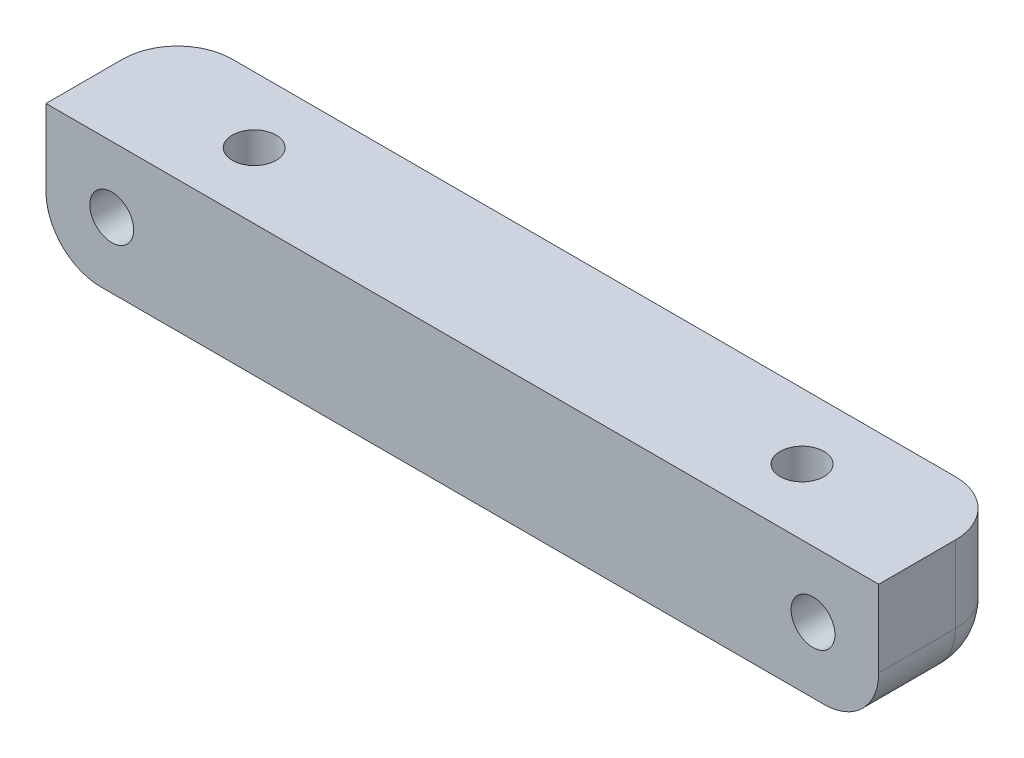
ISO-10303-21;
HEADER;
FILE_DESCRIPTION(('STEP AP214'),'2;1');
FILE_NAME('part.step','',(''),(''),'','','');
FILE_SCHEMA(('AUTOMOTIVE_DESIGN { 1 0 10303 214 1 1 1 1 }'));
ENDSEC;
DATA;
#1=APPLICATION_CONTEXT('core data for automotive mechanical design processes');
#2=APPLICATION_PROTOCOL_DEFINITION('international standard','automotive_design',2000,#1);
#3=PRODUCT_CONTEXT('',#1,'mechanical');
#4=PRODUCT('Part','Part','',(#3));
#5=PRODUCT_RELATED_PRODUCT_CATEGORY('part','',(#4));
#6=PRODUCT_DEFINITION_FORMATION('','',#4);
#7=PRODUCT_DEFINITION_CONTEXT('part definition',#1,'design');
#8=PRODUCT_DEFINITION('design','',#6,#7);
#9=PRODUCT_DEFINITION_SHAPE('','',#8);
#10=(LENGTH_UNIT() NAMED_UNIT(*) SI_UNIT(.MILLI.,.METRE.));
#11=(NAMED_UNIT(*) PLANE_ANGLE_UNIT() SI_UNIT($,.RADIAN.));
#12=(NAMED_UNIT(*) SI_UNIT($,.STERADIAN.) SOLID_ANGLE_UNIT());
#13=UNCERTAINTY_MEASURE_WITH_UNIT(LENGTH_MEASURE(1.E-05),#10,'distance_accuracy_value','');
#14=(GEOMETRIC_REPRESENTATION_CONTEXT(3) GLOBAL_UNCERTAINTY_ASSIGNED_CONTEXT((#13)) GLOBAL_UNIT_ASSIGNED_CONTEXT((#10,
#11,#12)) REPRESENTATION_CONTEXT('',''));
#15=CARTESIAN_POINT('',(0.,0.,0.));
#16=DIRECTION('',(0.,0.,1.));
#17=DIRECTION('',(1.,0.,0.));
#18=AXIS2_PLACEMENT_3D('',#15,#16,#17);
#19=CARTESIAN_POINT('',(-38.,6.,6.));
#20=DIRECTION('',(1.,0.,0.));
#21=DIRECTION('',(0.,0.,-1.));
#22=AXIS2_PLACEMENT_3D('',#19,#20,#21);
#23=PLANE('',#22);
#24=DIRECTION('',(0.,-1.,0.));
#25=VECTOR('',#24,1.);
#26=CARTESIAN_POINT('',(-38.,6.,-1.));
#27=LINE('',#26,#25);
#28=CARTESIAN_POINT('',(-38.,6.,-1.));
#29=VERTEX_POINT('',#28);
#30=CARTESIAN_POINT('',(-38.,-1.,-1.));
#31=VERTEX_POINT('',#30);
#32=EDGE_CURVE('E170',#29,#31,#27,.T.);
#33=ORIENTED_EDGE('',*,*,#32,.T.);
#34=DIRECTION('',(0.,0.,-1.));
#35=VECTOR('',#34,1.);
#36=CARTESIAN_POINT('',(-38.,-1.,6.));
#37=LINE('',#36,#35);
#38=CARTESIAN_POINT('',(-38.,-1.,6.));
#39=VERTEX_POINT('',#38);
#40=EDGE_CURVE('E173',#31,#39,#37,.F.);
#41=ORIENTED_EDGE('',*,*,#40,.T.);
#42=DIRECTION('',(0.,-1.,0.));
#43=VECTOR('',#42,1.);
#44=CARTESIAN_POINT('',(-38.,6.,6.));
#45=LINE('',#44,#43);
#46=CARTESIAN_POINT('',(-38.,6.,6.));
#47=VERTEX_POINT('',#46);
#48=EDGE_CURVE('E148',#47,#39,#45,.T.);
#49=ORIENTED_EDGE('',*,*,#48,.F.);
#50=DIRECTION('',(0.,0.,-1.));
#51=VECTOR('',#50,1.);
#52=CARTESIAN_POINT('',(-38.,6.,6.));
#53=LINE('',#52,#51);
#54=EDGE_CURVE('E133',#47,#29,#53,.T.);
#55=ORIENTED_EDGE('',*,*,#54,.T.);
#56=EDGE_LOOP('',(#33,#41,#49,#55));
#57=FACE_BOUND('',#56,.T.);
#58=ADVANCED_FACE('F44',(#57),#23,.F.);
#59=CARTESIAN_POINT('',(-38.,-6.,6.));
#60=DIRECTION('',(0.,1.,0.));
#61=DIRECTION('',(0.,0.,1.));
#62=AXIS2_PLACEMENT_3D('',#59,#60,#61);
#63=PLANE('',#62);
#64=DIRECTION('',(1.,0.,0.));
#65=VECTOR('',#64,1.);
#66=CARTESIAN_POINT('',(-38.,-6.,-1.));
#67=LINE('',#66,#65);
#68=CARTESIAN_POINT('',(-33.,-6.,-1.));
#69=VERTEX_POINT('',#68);
#70=CARTESIAN_POINT('',(33.,-6.,-1.));
#71=VERTEX_POINT('',#70);
#72=EDGE_CURVE('E156',#69,#71,#67,.T.);
#73=ORIENTED_EDGE('',*,*,#72,.T.);
#74=DIRECTION('',(0.,0.,-1.));
#75=VECTOR('',#74,1.);
#76=CARTESIAN_POINT('',(33.,-6.,6.));
#77=LINE('',#76,#75);
#78=CARTESIAN_POINT('',(33.,-6.,6.));
#79=VERTEX_POINT('',#78);
#80=EDGE_CURVE('E162',#71,#79,#77,.F.);
#81=ORIENTED_EDGE('',*,*,#80,.T.);
#82=DIRECTION('',(1.,0.,0.));
#83=VECTOR('',#82,1.);
#84=CARTESIAN_POINT('',(-38.,-6.,6.));
#85=LINE('',#84,#83);
#86=CARTESIAN_POINT('',(-33.,-6.,6.));
#87=VERTEX_POINT('',#86);
#88=EDGE_CURVE('E123',#87,#79,#85,.T.);
#89=ORIENTED_EDGE('',*,*,#88,.F.);
#90=DIRECTION('',(0.,0.,-1.));
#91=VECTOR('',#90,1.);
#92=CARTESIAN_POINT('',(-33.,-6.,6.));
#93=LINE('',#92,#91);
#94=EDGE_CURVE('E159',#87,#69,#93,.T.);
#95=ORIENTED_EDGE('',*,*,#94,.T.);
#96=EDGE_LOOP('',(#73,#81,#89,#95));
#97=FACE_BOUND('',#96,.T.);
#98=ADVANCED_FACE('F265',(#97),#63,.F.);
#99=CARTESIAN_POINT('',(38.,6.,6.));
#100=DIRECTION('',(-1.,0.,0.));
#101=DIRECTION('',(0.,0.,1.));
#102=AXIS2_PLACEMENT_3D('',#99,#100,#101);
#103=PLANE('',#102);
#104=DIRECTION('',(0.,1.,0.));
#105=VECTOR('',#104,1.);
#106=CARTESIAN_POINT('',(38.,6.,6.));
#107=LINE('',#106,#105);
#108=CARTESIAN_POINT('',(38.,-1.,6.));
#109=VERTEX_POINT('',#108);
#110=CARTESIAN_POINT('',(38.,6.,6.));
#111=VERTEX_POINT('',#110);
#112=EDGE_CURVE('E109',#109,#111,#107,.T.);
#113=ORIENTED_EDGE('',*,*,#112,.F.);
#114=DIRECTION('',(0.,0.,-1.));
#115=VECTOR('',#114,1.);
#116=CARTESIAN_POINT('',(38.,-1.,6.));
#117=LINE('',#116,#115);
#118=CARTESIAN_POINT('',(38.,-1.,-1.));
#119=VERTEX_POINT('',#118);
#120=EDGE_CURVE('E153',#109,#119,#117,.T.);
#121=ORIENTED_EDGE('',*,*,#120,.T.);
#122=DIRECTION('',(0.,1.,0.));
#123=VECTOR('',#122,1.);
#124=CARTESIAN_POINT('',(38.,6.,-1.));
#125=LINE('',#124,#123);
#126=CARTESIAN_POINT('',(38.,6.,-1.));
#127=VERTEX_POINT('',#126);
#128=EDGE_CURVE('E129',#119,#127,#125,.T.);
#129=ORIENTED_EDGE('',*,*,#128,.T.);
#130=DIRECTION('',(0.,0.,-1.));
#131=VECTOR('',#130,1.);
#132=CARTESIAN_POINT('',(38.,6.,6.));
#133=LINE('',#132,#131);
#134=EDGE_CURVE('E126',#111,#127,#133,.T.);
#135=ORIENTED_EDGE('',*,*,#134,.F.);
#136=EDGE_LOOP('',(#113,#121,#129,#135));
#137=FACE_BOUND('',#136,.T.);
#138=ADVANCED_FACE('F127',(#137),#103,.F.);
#139=CARTESIAN_POINT('',(-38.,6.,6.));
#140=DIRECTION('',(0.,-1.,0.));
#141=DIRECTION('',(0.,0.,-1.));
#142=AXIS2_PLACEMENT_3D('',#139,#140,#141);
#143=PLANE('',#142);
#144=CARTESIAN_POINT('',(-25.,6.,0.));
#145=DIRECTION('',(0.,1.,0.));
#146=DIRECTION('',(0.,0.,1.));
#147=AXIS2_PLACEMENT_3D('',#144,#145,#146);
#148=CIRCLE('',#147,2.);
#149=CARTESIAN_POINT('',(-25.,6.,2.));
#150=VERTEX_POINT('',#149);
#151=EDGE_CURVE('E220',#150,#150,#148,.T.);
#152=ORIENTED_EDGE('',*,*,#151,.F.);
#153=EDGE_LOOP('',(#152));
#154=FACE_BOUND('',#153,.T.);
#155=CARTESIAN_POINT('',(25.,6.,0.));
#156=DIRECTION('',(0.,1.,0.));
#157=DIRECTION('',(0.,0.,1.));
#158=AXIS2_PLACEMENT_3D('',#155,#156,#157);
#159=CIRCLE('',#158,2.);
#160=CARTESIAN_POINT('',(25.,6.,2.));
#161=VERTEX_POINT('',#160);
#162=EDGE_CURVE('E208',#161,#161,#159,.T.);
#163=ORIENTED_EDGE('',*,*,#162,.F.);
#164=EDGE_LOOP('',(#163));
#165=FACE_BOUND('',#164,.T.);
#166=DIRECTION('',(-1.,0.,0.));
#167=VECTOR('',#166,1.);
#168=CARTESIAN_POINT('',(-38.,6.,-6.));
#169=LINE('',#168,#167);
#170=CARTESIAN_POINT('',(33.,6.,-6.));
#171=VERTEX_POINT('',#170);
#172=CARTESIAN_POINT('',(-33.,6.,-6.));
#173=VERTEX_POINT('',#172);
#174=EDGE_CURVE('E146',#171,#173,#169,.T.);
#175=ORIENTED_EDGE('',*,*,#174,.T.);
#176=CARTESIAN_POINT('',(-33.,6.,-1.));
#177=DIRECTION('',(0.,-1.,0.));
#178=DIRECTION('',(0.,0.,-1.));
#179=AXIS2_PLACEMENT_3D('',#176,#177,#178);
#180=CIRCLE('',#179,5.);
#181=EDGE_CURVE('E11',#173,#29,#180,.F.);
#182=ORIENTED_EDGE('',*,*,#181,.T.);
#183=ORIENTED_EDGE('',*,*,#54,.F.);
#184=DIRECTION('',(-1.,0.,0.));
#185=VECTOR('',#184,1.);
#186=CARTESIAN_POINT('',(-38.,6.,6.));
#187=LINE('',#186,#185);
#188=EDGE_CURVE('E115',#111,#47,#187,.T.);
#189=ORIENTED_EDGE('',*,*,#188,.F.);
#190=ORIENTED_EDGE('',*,*,#134,.T.);
#191=CARTESIAN_POINT('',(33.,6.,-1.));
#192=DIRECTION('',(0.,-1.,0.));
#193=DIRECTION('',(0.,0.,-1.));
#194=AXIS2_PLACEMENT_3D('',#191,#192,#193);
#195=CIRCLE('',#194,5.);
#196=EDGE_CURVE('E54',#127,#171,#195,.F.);
#197=ORIENTED_EDGE('',*,*,#196,.T.);
#198=EDGE_LOOP('',(#175,#182,#183,#189,#190,#197));
#199=FACE_BOUND('',#198,.T.);
#200=ADVANCED_FACE('F136',(#154,#165,#199),#143,.F.);
#201=CARTESIAN_POINT('',(0.,0.,6.));
#202=DIRECTION('',(0.,0.,1.));
#203=DIRECTION('',(1.,0.,0.));
#204=AXIS2_PLACEMENT_3D('',#201,#202,#203);
#205=PLANE('',#204);
#206=CARTESIAN_POINT('',(-32.,0.,6.));
#207=DIRECTION('',(0.,0.,1.));
#208=DIRECTION('',(1.,0.,0.));
#209=AXIS2_PLACEMENT_3D('',#206,#207,#208);
#210=CIRCLE('',#209,2.);
#211=CARTESIAN_POINT('',(-30.,0.,6.));
#212=VERTEX_POINT('',#211);
#213=EDGE_CURVE('E227',#212,#212,#210,.T.);
#214=ORIENTED_EDGE('',*,*,#213,.F.);
#215=EDGE_LOOP('',(#214));
#216=FACE_BOUND('',#215,.T.);
#217=CARTESIAN_POINT('',(32.,0.,6.));
#218=DIRECTION('',(0.,0.,1.));
#219=DIRECTION('',(1.,0.,0.));
#220=AXIS2_PLACEMENT_3D('',#217,#218,#219);
#221=CIRCLE('',#220,2.00000000000001);
#222=CARTESIAN_POINT('',(34.,0.,6.));
#223=VERTEX_POINT('',#222);
#224=EDGE_CURVE('E235',#223,#223,#221,.T.);
#225=ORIENTED_EDGE('',*,*,#224,.F.);
#226=EDGE_LOOP('',(#225));
#227=FACE_BOUND('',#226,.T.);
#228=ORIENTED_EDGE('',*,*,#88,.T.);
#229=CARTESIAN_POINT('',(33.,-1.,6.));
#230=DIRECTION('',(0.,0.,1.));
#231=DIRECTION('',(1.,0.,0.));
#232=AXIS2_PLACEMENT_3D('',#229,#230,#231);
#233=CIRCLE('',#232,5.);
#234=EDGE_CURVE('E118',#79,#109,#233,.T.);
#235=ORIENTED_EDGE('',*,*,#234,.T.);
#236=ORIENTED_EDGE('',*,*,#112,.T.);
#237=ORIENTED_EDGE('',*,*,#188,.T.);
#238=ORIENTED_EDGE('',*,*,#48,.T.);
#239=CARTESIAN_POINT('',(-33.,-1.,6.));
#240=DIRECTION('',(0.,0.,1.));
#241=DIRECTION('',(1.,0.,0.));
#242=AXIS2_PLACEMENT_3D('',#239,#240,#241);
#243=CIRCLE('',#242,5.);
#244=EDGE_CURVE('E165',#39,#87,#243,.T.);
#245=ORIENTED_EDGE('',*,*,#244,.T.);
#246=EDGE_LOOP('',(#228,#235,#236,#237,#238,#245));
#247=FACE_BOUND('',#246,.T.);
#248=ADVANCED_FACE('F112',(#216,#227,#247),#205,.T.);
#249=CARTESIAN_POINT('',(0.,0.,-6.));
#250=DIRECTION('',(0.,0.,1.));
#251=DIRECTION('',(1.,0.,0.));
#252=AXIS2_PLACEMENT_3D('',#249,#250,#251);
#253=PLANE('',#252);
#254=DIRECTION('',(1.,0.,0.));
#255=VECTOR('',#254,1.);
#256=CARTESIAN_POINT('',(0.,-1.,-6.));
#257=LINE('',#256,#255);
#258=CARTESIAN_POINT('',(33.,-1.,-6.));
#259=VERTEX_POINT('',#258);
#260=CARTESIAN_POINT('',(-33.,-1.,-6.));
#261=VERTEX_POINT('',#260);
#262=EDGE_CURVE('E62',#259,#261,#257,.F.);
#263=ORIENTED_EDGE('',*,*,#262,.T.);
#264=DIRECTION('',(0.,-1.,0.));
#265=VECTOR('',#264,1.);
#266=CARTESIAN_POINT('',(-33.,0.,-6.));
#267=LINE('',#266,#265);
#268=EDGE_CURVE('E180',#261,#173,#267,.F.);
#269=ORIENTED_EDGE('',*,*,#268,.T.);
#270=ORIENTED_EDGE('',*,*,#174,.F.);
#271=DIRECTION('',(0.,1.,0.));
#272=VECTOR('',#271,1.);
#273=CARTESIAN_POINT('',(33.,0.,-6.));
#274=LINE('',#273,#272);
#275=EDGE_CURVE('E67',#171,#259,#274,.F.);
#276=ORIENTED_EDGE('',*,*,#275,.T.);
#277=EDGE_LOOP('',(#263,#269,#270,#276));
#278=FACE_BOUND('',#277,.T.);
#279=ADVANCED_FACE('F258',(#278),#253,.F.);
#280=CARTESIAN_POINT('',(32.,0.,-2.5));
#281=DIRECTION('',(0.,0.,1.));
#282=DIRECTION('',(1.,0.,0.));
#283=AXIS2_PLACEMENT_3D('',#280,#281,#282);
#284=CYLINDRICAL_SURFACE('',#283,2.00000000000001);
#285=CARTESIAN_POINT('',(32.,0.,-2.5));
#286=DIRECTION('',(0.,0.,1.));
#287=DIRECTION('',(1.,0.,0.));
#288=AXIS2_PLACEMENT_3D('',#285,#286,#287);
#289=CIRCLE('',#288,2.00000000000001);
#290=CARTESIAN_POINT('',(34.,0.,-2.5));
#291=VERTEX_POINT('',#290);
#292=EDGE_CURVE('E231',#291,#291,#289,.T.);
#293=ORIENTED_EDGE('',*,*,#292,.F.);
#294=EDGE_LOOP('',(#293));
#295=FACE_BOUND('',#294,.T.);
#296=ORIENTED_EDGE('',*,*,#224,.T.);
#297=EDGE_LOOP('',(#296));
#298=FACE_BOUND('',#297,.T.);
#299=ADVANCED_FACE('F352',(#295,#298),#284,.F.);
#300=CARTESIAN_POINT('',(32.,0.,-2.5));
#301=DIRECTION('',(0.,0.,1.));
#302=DIRECTION('',(1.,0.,0.));
#303=AXIS2_PLACEMENT_3D('',#300,#301,#302);
#304=PLANE('',#303);
#305=ORIENTED_EDGE('',*,*,#292,.T.);
#306=EDGE_LOOP('',(#305));
#307=FACE_BOUND('',#306,.T.);
#308=ADVANCED_FACE('F458',(#307),#304,.T.);
#309=CARTESIAN_POINT('',(-32.,0.,-2.5));
#310=DIRECTION('',(0.,0.,1.));
#311=DIRECTION('',(1.,0.,0.));
#312=AXIS2_PLACEMENT_3D('',#309,#310,#311);
#313=CYLINDRICAL_SURFACE('',#312,2.);
#314=CARTESIAN_POINT('',(-32.,0.,-2.5));
#315=DIRECTION('',(0.,0.,1.));
#316=DIRECTION('',(1.,0.,0.));
#317=AXIS2_PLACEMENT_3D('',#314,#315,#316);
#318=CIRCLE('',#317,2.);
#319=CARTESIAN_POINT('',(-30.,0.,-2.5));
#320=VERTEX_POINT('',#319);
#321=EDGE_CURVE('E149',#320,#320,#318,.T.);
#322=ORIENTED_EDGE('',*,*,#321,.F.);
#323=EDGE_LOOP('',(#322));
#324=FACE_BOUND('',#323,.T.);
#325=ORIENTED_EDGE('',*,*,#213,.T.);
#326=EDGE_LOOP('',(#325));
#327=FACE_BOUND('',#326,.T.);
#328=ADVANCED_FACE('F447',(#324,#327),#313,.F.);
#329=CARTESIAN_POINT('',(-32.,0.,-2.5));
#330=DIRECTION('',(0.,0.,1.));
#331=DIRECTION('',(1.,0.,0.));
#332=AXIS2_PLACEMENT_3D('',#329,#330,#331);
#333=PLANE('',#332);
#334=ORIENTED_EDGE('',*,*,#321,.T.);
#335=EDGE_LOOP('',(#334));
#336=FACE_BOUND('',#335,.T.);
#337=ADVANCED_FACE('F436',(#336),#333,.T.);
#338=CARTESIAN_POINT('',(25.,-2.5,0.));
#339=DIRECTION('',(0.,1.,0.));
#340=DIRECTION('',(0.,0.,1.));
#341=AXIS2_PLACEMENT_3D('',#338,#339,#340);
#342=CYLINDRICAL_SURFACE('',#341,2.);
#343=CARTESIAN_POINT('',(25.,-2.5,0.));
#344=DIRECTION('',(0.,1.,0.));
#345=DIRECTION('',(0.,0.,1.));
#346=AXIS2_PLACEMENT_3D('',#343,#344,#345);
#347=CIRCLE('',#346,2.);
#348=CARTESIAN_POINT('',(25.,-2.5,2.));
#349=VERTEX_POINT('',#348);
#350=EDGE_CURVE('E213',#349,#349,#347,.T.);
#351=ORIENTED_EDGE('',*,*,#350,.F.);
#352=EDGE_LOOP('',(#351));
#353=FACE_BOUND('',#352,.T.);
#354=ORIENTED_EDGE('',*,*,#162,.T.);
#355=EDGE_LOOP('',(#354));
#356=FACE_BOUND('',#355,.T.);
#357=ADVANCED_FACE('F425',(#353,#356),#342,.F.);
#358=CARTESIAN_POINT('',(25.,-2.5,0.));
#359=DIRECTION('',(0.,1.,0.));
#360=DIRECTION('',(0.,0.,1.));
#361=AXIS2_PLACEMENT_3D('',#358,#359,#360);
#362=PLANE('',#361);
#363=ORIENTED_EDGE('',*,*,#350,.T.);
#364=EDGE_LOOP('',(#363));
#365=FACE_BOUND('',#364,.T.);
#366=ADVANCED_FACE('F414',(#365),#362,.T.);
#367=CARTESIAN_POINT('',(-25.,-2.5,0.));
#368=DIRECTION('',(0.,1.,0.));
#369=DIRECTION('',(0.,0.,1.));
#370=AXIS2_PLACEMENT_3D('',#367,#368,#369);
#371=CYLINDRICAL_SURFACE('',#370,2.);
#372=CARTESIAN_POINT('',(-25.,-2.5,0.));
#373=DIRECTION('',(0.,1.,0.));
#374=DIRECTION('',(0.,0.,1.));
#375=AXIS2_PLACEMENT_3D('',#372,#373,#374);
#376=CIRCLE('',#375,2.);
#377=CARTESIAN_POINT('',(-25.,-2.5,2.));
#378=VERTEX_POINT('',#377);
#379=EDGE_CURVE('E239',#378,#378,#376,.T.);
#380=ORIENTED_EDGE('',*,*,#379,.F.);
#381=EDGE_LOOP('',(#380));
#382=FACE_BOUND('',#381,.T.);
#383=ORIENTED_EDGE('',*,*,#151,.T.);
#384=EDGE_LOOP('',(#383));
#385=FACE_BOUND('',#384,.T.);
#386=ADVANCED_FACE('F403',(#382,#385),#371,.F.);
#387=CARTESIAN_POINT('',(-25.,-2.5,0.));
#388=DIRECTION('',(0.,1.,0.));
#389=DIRECTION('',(0.,0.,1.));
#390=AXIS2_PLACEMENT_3D('',#387,#388,#389);
#391=PLANE('',#390);
#392=ORIENTED_EDGE('',*,*,#379,.T.);
#393=EDGE_LOOP('',(#392));
#394=FACE_BOUND('',#393,.T.);
#395=ADVANCED_FACE('F341',(#394),#391,.T.);
#396=CARTESIAN_POINT('',(-33.,6.,-1.));
#397=DIRECTION('',(0.,-1.,0.));
#398=DIRECTION('',(0.,0.,-1.));
#399=AXIS2_PLACEMENT_3D('',#396,#397,#398);
#400=CYLINDRICAL_SURFACE('',#399,5.);
#401=ORIENTED_EDGE('',*,*,#181,.F.);
#402=ORIENTED_EDGE('',*,*,#268,.F.);
#403=CARTESIAN_POINT('',(-33.,-1.,-1.));
#404=DIRECTION('',(0.,-1.,0.));
#405=DIRECTION('',(0.,0.,-1.));
#406=AXIS2_PLACEMENT_3D('',#403,#404,#405);
#407=CIRCLE('',#406,5.);
#408=EDGE_CURVE('E48',#31,#261,#407,.T.);
#409=ORIENTED_EDGE('',*,*,#408,.F.);
#410=ORIENTED_EDGE('',*,*,#32,.F.);
#411=EDGE_LOOP('',(#401,#402,#409,#410));
#412=FACE_BOUND('',#411,.T.);
#413=ADVANCED_FACE('F46',(#412),#400,.T.);
#414=CARTESIAN_POINT('',(-33.,-1.,6.));
#415=DIRECTION('',(0.,0.,-1.));
#416=DIRECTION('',(-1.,0.,0.));
#417=AXIS2_PLACEMENT_3D('',#414,#415,#416);
#418=CYLINDRICAL_SURFACE('',#417,5.);
#419=ORIENTED_EDGE('',*,*,#244,.F.);
#420=ORIENTED_EDGE('',*,*,#40,.F.);
#421=CARTESIAN_POINT('',(-33.,-1.,-1.));
#422=DIRECTION('',(0.,0.,-1.));
#423=DIRECTION('',(-1.,0.,0.));
#424=AXIS2_PLACEMENT_3D('',#421,#422,#423);
#425=CIRCLE('',#424,5.);
#426=EDGE_CURVE('E199',#69,#31,#425,.T.);
#427=ORIENTED_EDGE('',*,*,#426,.F.);
#428=ORIENTED_EDGE('',*,*,#94,.F.);
#429=EDGE_LOOP('',(#419,#420,#427,#428));
#430=FACE_BOUND('',#429,.T.);
#431=ADVANCED_FACE('F264',(#430),#418,.T.);
#432=CARTESIAN_POINT('',(-33.,-1.,-1.));
#433=DIRECTION('',(-1.,0.,0.));
#434=DIRECTION('',(0.,0.,1.));
#435=AXIS2_PLACEMENT_3D('',#432,#433,#434);
#436=SPHERICAL_SURFACE('',#435,5.);
#437=ORIENTED_EDGE('',*,*,#426,.T.);
#438=ORIENTED_EDGE('',*,*,#408,.T.);
#439=CARTESIAN_POINT('',(-33.,-1.,-1.));
#440=DIRECTION('',(-1.,0.,0.));
#441=DIRECTION('',(0.,0.,1.));
#442=AXIS2_PLACEMENT_3D('',#439,#440,#441);
#443=CIRCLE('',#442,5.);
#444=EDGE_CURVE('E196',#69,#261,#443,.F.);
#445=ORIENTED_EDGE('',*,*,#444,.F.);
#446=EDGE_LOOP('',(#437,#438,#445));
#447=FACE_BOUND('',#446,.T.);
#448=ADVANCED_FACE('F269',(#447),#436,.T.);
#449=CARTESIAN_POINT('',(33.,6.,-1.));
#450=DIRECTION('',(0.,1.,0.));
#451=DIRECTION('',(0.,0.,1.));
#452=AXIS2_PLACEMENT_3D('',#449,#450,#451);
#453=CYLINDRICAL_SURFACE('',#452,5.);
#454=ORIENTED_EDGE('',*,*,#196,.F.);
#455=ORIENTED_EDGE('',*,*,#128,.F.);
#456=CARTESIAN_POINT('',(33.,-1.,-1.));
#457=DIRECTION('',(0.,-1.,0.));
#458=DIRECTION('',(0.,0.,-1.));
#459=AXIS2_PLACEMENT_3D('',#456,#457,#458);
#460=CIRCLE('',#459,5.);
#461=EDGE_CURVE('E192',#259,#119,#460,.T.);
#462=ORIENTED_EDGE('',*,*,#461,.F.);
#463=ORIENTED_EDGE('',*,*,#275,.F.);
#464=EDGE_LOOP('',(#454,#455,#462,#463));
#465=FACE_BOUND('',#464,.T.);
#466=ADVANCED_FACE('F256',(#465),#453,.T.);
#467=CARTESIAN_POINT('',(-38.,-1.,-1.));
#468=DIRECTION('',(1.,0.,0.));
#469=DIRECTION('',(0.,0.,-1.));
#470=AXIS2_PLACEMENT_3D('',#467,#468,#469);
#471=CYLINDRICAL_SURFACE('',#470,5.);
#472=ORIENTED_EDGE('',*,*,#444,.T.);
#473=ORIENTED_EDGE('',*,*,#262,.F.);
#474=CARTESIAN_POINT('',(33.,-1.,-1.));
#475=DIRECTION('',(1.,0.,0.));
#476=DIRECTION('',(0.,0.,-1.));
#477=AXIS2_PLACEMENT_3D('',#474,#475,#476);
#478=CIRCLE('',#477,5.);
#479=EDGE_CURVE('E188',#71,#259,#478,.T.);
#480=ORIENTED_EDGE('',*,*,#479,.F.);
#481=ORIENTED_EDGE('',*,*,#72,.F.);
#482=EDGE_LOOP('',(#472,#473,#480,#481));
#483=FACE_BOUND('',#482,.T.);
#484=ADVANCED_FACE('F268',(#483),#471,.T.);
#485=CARTESIAN_POINT('',(33.,-1.,-1.));
#486=DIRECTION('',(0.,0.,-1.));
#487=DIRECTION('',(-1.,0.,0.));
#488=AXIS2_PLACEMENT_3D('',#485,#486,#487);
#489=SPHERICAL_SURFACE('',#488,5.);
#490=ORIENTED_EDGE('',*,*,#479,.T.);
#491=ORIENTED_EDGE('',*,*,#461,.T.);
#492=CARTESIAN_POINT('',(33.,-1.,-1.));
#493=DIRECTION('',(0.,0.,-1.));
#494=DIRECTION('',(-1.,0.,0.));
#495=AXIS2_PLACEMENT_3D('',#492,#493,#494);
#496=CIRCLE('',#495,5.);
#497=EDGE_CURVE('E185',#71,#119,#496,.F.);
#498=ORIENTED_EDGE('',*,*,#497,.F.);
#499=EDGE_LOOP('',(#490,#491,#498));
#500=FACE_BOUND('',#499,.T.);
#501=ADVANCED_FACE('F253',(#500),#489,.T.);
#502=CARTESIAN_POINT('',(33.,-1.,6.));
#503=DIRECTION('',(0.,0.,-1.));
#504=DIRECTION('',(-1.,0.,0.));
#505=AXIS2_PLACEMENT_3D('',#502,#503,#504);
#506=CYLINDRICAL_SURFACE('',#505,5.);
#507=ORIENTED_EDGE('',*,*,#234,.F.);
#508=ORIENTED_EDGE('',*,*,#80,.F.);
#509=ORIENTED_EDGE('',*,*,#497,.T.);
#510=ORIENTED_EDGE('',*,*,#120,.F.);
#511=EDGE_LOOP('',(#507,#508,#509,#510));
#512=FACE_BOUND('',#511,.T.);
#513=ADVANCED_FACE('F249',(#512),#506,.T.);
#514=CLOSED_SHELL('',(#58,#98,#138,#200,#248,#279,#299,#308,#328,#337,#357,#366,#386,#395,#413,
#431,#448,#466,#484,#501,#513));
#515=MANIFOLD_SOLID_BREP('B2',#514);
#516=ADVANCED_BREP_SHAPE_REPRESENTATION('',(#18,#515),#14);
#517=SHAPE_DEFINITION_REPRESENTATION(#9,#516);
ENDSEC;
END-ISO-10303-21;
